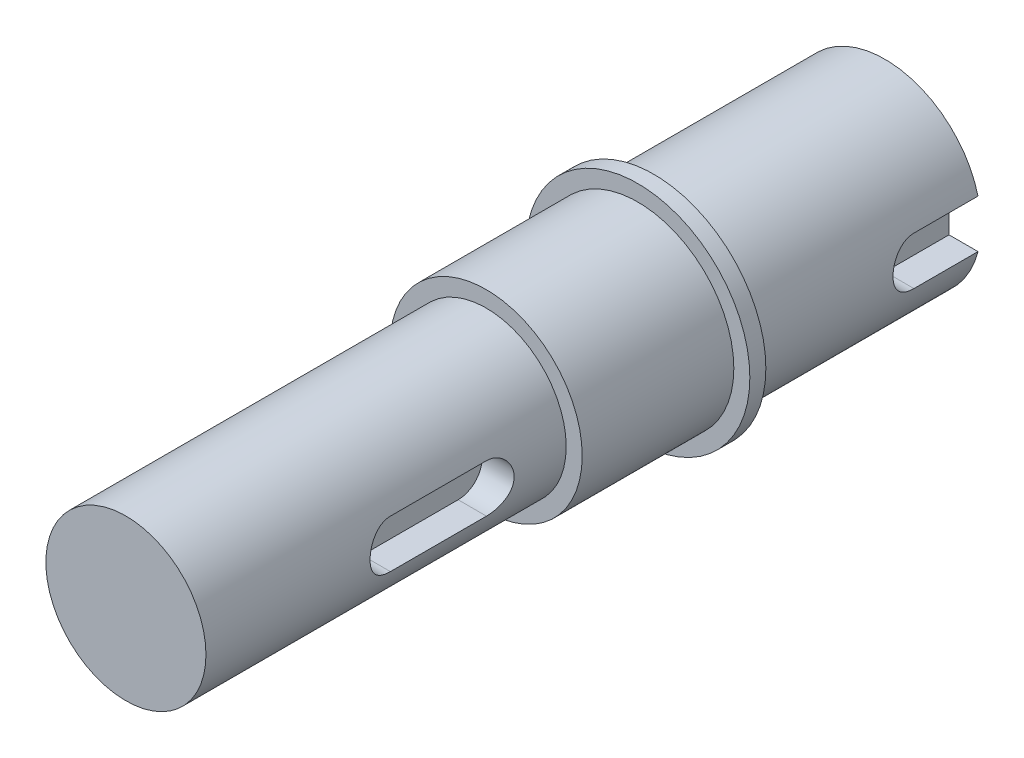
ISO-10303-21;
HEADER;
FILE_DESCRIPTION(('STEP AP214'),'2;1');
FILE_NAME('part.step','',(''),(''),'','','');
FILE_SCHEMA(('AUTOMOTIVE_DESIGN { 1 0 10303 214 1 1 1 1 }'));
ENDSEC;
DATA;
#1=APPLICATION_CONTEXT('core data for automotive mechanical design processes');
#2=APPLICATION_PROTOCOL_DEFINITION('international standard','automotive_design',2000,#1);
#3=PRODUCT_CONTEXT('',#1,'mechanical');
#4=PRODUCT('Part','Part','',(#3));
#5=PRODUCT_RELATED_PRODUCT_CATEGORY('part','',(#4));
#6=PRODUCT_DEFINITION_FORMATION('','',#4);
#7=PRODUCT_DEFINITION_CONTEXT('part definition',#1,'design');
#8=PRODUCT_DEFINITION('design','',#6,#7);
#9=PRODUCT_DEFINITION_SHAPE('','',#8);
#10=(LENGTH_UNIT() NAMED_UNIT(*) SI_UNIT(.MILLI.,.METRE.));
#11=(NAMED_UNIT(*) PLANE_ANGLE_UNIT() SI_UNIT($,.RADIAN.));
#12=(NAMED_UNIT(*) SI_UNIT($,.STERADIAN.) SOLID_ANGLE_UNIT());
#13=UNCERTAINTY_MEASURE_WITH_UNIT(LENGTH_MEASURE(1.E-05),#10,'distance_accuracy_value','');
#14=(GEOMETRIC_REPRESENTATION_CONTEXT(3) GLOBAL_UNCERTAINTY_ASSIGNED_CONTEXT((#13)) GLOBAL_UNIT_ASSIGNED_CONTEXT((#10,
#11,#12)) REPRESENTATION_CONTEXT('',''));
#15=CARTESIAN_POINT('',(0.,0.,0.));
#16=DIRECTION('',(0.,0.,1.));
#17=DIRECTION('',(1.,0.,0.));
#18=AXIS2_PLACEMENT_3D('',#15,#16,#17);
#19=CARTESIAN_POINT('',(0.,0.,-9.47));
#20=DIRECTION('',(0.,0.,-1.));
#21=DIRECTION('',(-1.,0.,0.));
#22=AXIS2_PLACEMENT_3D('',#19,#20,#21);
#23=CYLINDRICAL_SURFACE('',#22,7.);
#24=CARTESIAN_POINT('',(0.,0.,-9.47));
#25=DIRECTION('',(0.,0.,1.));
#26=DIRECTION('',(1.,0.,0.));
#27=AXIS2_PLACEMENT_3D('',#24,#25,#26);
#28=CIRCLE('',#27,7.);
#29=CARTESIAN_POINT('',(7.,0.,-9.47));
#30=VERTEX_POINT('',#29);
#31=EDGE_CURVE('E482',#30,#30,#28,.T.);
#32=ORIENTED_EDGE('',*,*,#31,.F.);
#33=EDGE_LOOP('',(#32));
#34=FACE_BOUND('',#33,.T.);
#35=CARTESIAN_POINT('',(0.,0.,-10.47));
#36=DIRECTION('',(0.,0.,1.));
#37=DIRECTION('',(1.,0.,0.));
#38=AXIS2_PLACEMENT_3D('',#35,#36,#37);
#39=CIRCLE('',#38,7.);
#40=CARTESIAN_POINT('',(7.,0.,-10.47));
#41=VERTEX_POINT('',#40);
#42=EDGE_CURVE('E481',#41,#41,#39,.T.);
#43=ORIENTED_EDGE('',*,*,#42,.T.);
#44=EDGE_LOOP('',(#43));
#45=FACE_BOUND('',#44,.T.);
#46=ADVANCED_FACE('F39',(#34,#45),#23,.T.);
#47=CARTESIAN_POINT('',(0.,0.,-9.47));
#48=DIRECTION('',(0.,0.,1.));
#49=DIRECTION('',(1.,0.,0.));
#50=AXIS2_PLACEMENT_3D('',#47,#48,#49);
#51=PLANE('',#50);
#52=CARTESIAN_POINT('',(0.,0.,-9.47));
#53=DIRECTION('',(0.,0.,1.));
#54=DIRECTION('',(1.,0.,0.));
#55=AXIS2_PLACEMENT_3D('',#52,#53,#54);
#56=CIRCLE('',#55,6.);
#57=CARTESIAN_POINT('',(6.,0.,-9.47));
#58=VERTEX_POINT('',#57);
#59=EDGE_CURVE('E44',#58,#58,#56,.T.);
#60=ORIENTED_EDGE('',*,*,#59,.F.);
#61=EDGE_LOOP('',(#60));
#62=FACE_BOUND('',#61,.T.);
#63=ORIENTED_EDGE('',*,*,#31,.T.);
#64=EDGE_LOOP('',(#63));
#65=FACE_BOUND('',#64,.T.);
#66=ADVANCED_FACE('F223',(#62,#65),#51,.T.);
#67=CARTESIAN_POINT('',(0.,0.,-10.47));
#68=DIRECTION('',(0.,0.,1.));
#69=DIRECTION('',(1.,0.,0.));
#70=AXIS2_PLACEMENT_3D('',#67,#68,#69);
#71=PLANE('',#70);
#72=CARTESIAN_POINT('',(0.,0.,-10.47));
#73=DIRECTION('',(0.,0.,1.));
#74=DIRECTION('',(1.,0.,0.));
#75=AXIS2_PLACEMENT_3D('',#72,#73,#74);
#76=CIRCLE('',#75,6.);
#77=CARTESIAN_POINT('',(6.,0.,-10.47));
#78=VERTEX_POINT('',#77);
#79=EDGE_CURVE('E11',#78,#78,#76,.T.);
#80=ORIENTED_EDGE('',*,*,#79,.T.);
#81=EDGE_LOOP('',(#80));
#82=FACE_BOUND('',#81,.T.);
#83=ORIENTED_EDGE('',*,*,#42,.F.);
#84=EDGE_LOOP('',(#83));
#85=FACE_BOUND('',#84,.T.);
#86=ADVANCED_FACE('F229',(#82,#85),#71,.F.);
#87=CARTESIAN_POINT('',(3.,0.,10.75));
#88=DIRECTION('',(1.,0.,0.));
#89=DIRECTION('',(0.,0.,-1.));
#90=AXIS2_PLACEMENT_3D('',#87,#88,#89);
#91=PLANE('',#90);
#92=CARTESIAN_POINT('',(3.,0.,10.75));
#93=DIRECTION('',(1.,0.,0.));
#94=DIRECTION('',(0.,0.,-1.));
#95=AXIS2_PLACEMENT_3D('',#92,#93,#94);
#96=CIRCLE('',#95,1.5);
#97=CARTESIAN_POINT('',(3.,1.5,10.75));
#98=VERTEX_POINT('',#97);
#99=CARTESIAN_POINT('',(3.,-1.5,10.75));
#100=VERTEX_POINT('',#99);
#101=EDGE_CURVE('E149',#98,#100,#96,.T.);
#102=ORIENTED_EDGE('',*,*,#101,.T.);
#103=DIRECTION('',(0.,0.,-1.));
#104=VECTOR('',#103,1.);
#105=CARTESIAN_POINT('',(3.,-1.5,10.75));
#106=LINE('',#105,#104);
#107=CARTESIAN_POINT('',(3.,-1.5,4.75));
#108=VERTEX_POINT('',#107);
#109=EDGE_CURVE('E152',#100,#108,#106,.T.);
#110=ORIENTED_EDGE('',*,*,#109,.T.);
#111=CARTESIAN_POINT('',(3.,0.,4.75));
#112=DIRECTION('',(1.,0.,0.));
#113=DIRECTION('',(0.,0.,-1.));
#114=AXIS2_PLACEMENT_3D('',#111,#112,#113);
#115=CIRCLE('',#114,1.5);
#116=CARTESIAN_POINT('',(3.,1.5,4.75));
#117=VERTEX_POINT('',#116);
#118=EDGE_CURVE('E155',#108,#117,#115,.T.);
#119=ORIENTED_EDGE('',*,*,#118,.T.);
#120=DIRECTION('',(0.,0.,1.));
#121=VECTOR('',#120,1.);
#122=CARTESIAN_POINT('',(3.,1.5,10.75));
#123=LINE('',#122,#121);
#124=EDGE_CURVE('E158',#117,#98,#123,.T.);
#125=ORIENTED_EDGE('',*,*,#124,.T.);
#126=EDGE_LOOP('',(#102,#110,#119,#125));
#127=FACE_BOUND('',#126,.T.);
#128=ADVANCED_FACE('F266',(#127),#91,.T.);
#129=CARTESIAN_POINT('',(0.,0.,22.5));
#130=DIRECTION('',(0.,0.,1.));
#131=DIRECTION('',(1.,0.,0.));
#132=AXIS2_PLACEMENT_3D('',#129,#130,#131);
#133=PLANE('',#132);
#134=CARTESIAN_POINT('',(0.,0.,22.5));
#135=DIRECTION('',(0.,0.,1.));
#136=DIRECTION('',(1.,0.,0.));
#137=AXIS2_PLACEMENT_3D('',#134,#135,#136);
#138=CIRCLE('',#137,5.);
#139=CARTESIAN_POINT('',(5.,0.,22.5));
#140=VERTEX_POINT('',#139);
#141=EDGE_CURVE('E146',#140,#140,#138,.T.);
#142=ORIENTED_EDGE('',*,*,#141,.T.);
#143=EDGE_LOOP('',(#142));
#144=FACE_BOUND('',#143,.T.);
#145=ADVANCED_FACE('F206',(#144),#133,.T.);
#146=CARTESIAN_POINT('',(3.,0.,10.75));
#147=DIRECTION('',(1.,0.,0.));
#148=DIRECTION('',(0.,0.,-1.));
#149=AXIS2_PLACEMENT_3D('',#146,#147,#148);
#150=CYLINDRICAL_SURFACE('',#149,1.5);
#151=DIRECTION('',(1.,0.,0.));
#152=VECTOR('',#151,1.);
#153=CARTESIAN_POINT('',(3.,-1.5,10.75));
#154=LINE('',#153,#152);
#155=CARTESIAN_POINT('',(4.76969600708473,-1.5,10.75));
#156=VERTEX_POINT('',#155);
#157=EDGE_CURVE('E161',#100,#156,#154,.T.);
#158=ORIENTED_EDGE('',*,*,#157,.F.);
#159=ORIENTED_EDGE('',*,*,#101,.F.);
#160=DIRECTION('',(1.,0.,0.));
#161=VECTOR('',#160,1.);
#162=CARTESIAN_POINT('',(3.,1.5,10.75));
#163=LINE('',#162,#161);
#164=CARTESIAN_POINT('',(4.76969600708473,1.5,10.75));
#165=VERTEX_POINT('',#164);
#166=EDGE_CURVE('E162',#98,#165,#163,.T.);
#167=ORIENTED_EDGE('',*,*,#166,.T.);
#168=CARTESIAN_POINT('',(4.76969600708473,-1.5,10.75));
#169=CARTESIAN_POINT('',(4.76969249084934,-1.50000085357071,10.791179392908));
#170=CARTESIAN_POINT('',(4.77022997000129,-1.49830317083428,10.8323380431261));
#171=CARTESIAN_POINT('',(4.77235095109999,-1.49153785660317,10.9143411620956));
#172=CARTESIAN_POINT('',(4.77393421787376,-1.48647098275841,10.9551856993949));
#173=CARTESIAN_POINT('',(4.78018490618873,-1.46630203689311,11.0765905409547));
#174=CARTESIAN_POINT('',(4.78635370384275,-1.44623120413662,11.1563063904164));
#175=CARTESIAN_POINT('',(4.80195952113208,-1.39353102315626,11.3110355783859));
#176=CARTESIAN_POINT('',(4.81139539670393,-1.36090607068203,11.3860505521981));
#177=CARTESIAN_POINT('',(4.83246571212052,-1.28407841117655,11.5295966815976));
#178=CARTESIAN_POINT('',(4.84410117434933,-1.23987031651226,11.5981247997284));
#179=CARTESIAN_POINT('',(4.86866835244721,-1.13964850658326,11.728866055997));
#180=CARTESIAN_POINT('',(4.88162755412974,-1.08333433465208,11.7908436603434));
#181=CARTESIAN_POINT('',(4.90714811559049,-0.961138919873354,11.9046355839));
#182=CARTESIAN_POINT('',(4.91970940785249,-0.895256063916348,11.9564481860031));
#183=CARTESIAN_POINT('',(4.94333239727705,-0.75410992131543,12.0494637703185));
#184=CARTESIAN_POINT('',(4.95435770971354,-0.678680819336259,12.090425180298));
#185=CARTESIAN_POINT('',(4.97334469846208,-0.521621185505775,12.1589884116182));
#186=CARTESIAN_POINT('',(4.98130716463903,-0.439992259012928,12.1865936777943));
#187=CARTESIAN_POINT('',(4.99307639935002,-0.275324697874879,12.226879799102));
#188=CARTESIAN_POINT('',(4.99699549276993,-0.192393125294254,12.2399648579697));
#189=CARTESIAN_POINT('',(5.00063202022426,-0.0254235719980825,12.2521173413633));
#190=CARTESIAN_POINT('',(5.00035024971471,0.0586141962423617,12.2511874197002));
#191=CARTESIAN_POINT('',(4.99569602566267,0.222571599946016,12.235607091241));
#192=CARTESIAN_POINT('',(4.99145415509187,0.30253714546464,12.2213946550213));
#193=CARTESIAN_POINT('',(4.9795151369998,0.458890052102024,12.1803683647619));
#194=CARTESIAN_POINT('',(4.97181780846028,0.535277225531997,12.1535538505441));
#195=CARTESIAN_POINT('',(4.95365214926145,0.683347815892215,12.0877877783536));
#196=CARTESIAN_POINT('',(4.94315255692525,0.754966006044141,12.0486983556431));
#197=CARTESIAN_POINT('',(4.92049624651755,0.890765529574419,11.9596014099517));
#198=CARTESIAN_POINT('',(4.90833915735884,0.954945191614593,11.9095914405212));
#199=CARTESIAN_POINT('',(4.88311673571409,1.07665450541275,11.7978080119165));
#200=CARTESIAN_POINT('',(4.87003445449554,1.13383351478034,11.7356561362393));
#201=CARTESIAN_POINT('',(4.84484215114658,1.23706769492487,11.6025025765721));
#202=CARTESIAN_POINT('',(4.83273241337565,1.28311962013078,11.5314983196345));
#203=CARTESIAN_POINT('',(4.81077228795653,1.36316407240863,11.3817190715507));
#204=CARTESIAN_POINT('',(4.80094596245948,1.39703006341135,11.3028728204066));
#205=CARTESIAN_POINT('',(4.78495663653201,1.45085886004699,11.1402754960183));
#206=CARTESIAN_POINT('',(4.77878803475875,1.47084293218035,11.0565321392856));
#207=CARTESIAN_POINT('',(4.77314032325006,1.4890120359008,10.9350051109298));
#208=CARTESIAN_POINT('',(4.77185156275267,1.49313202989009,10.8981092658204));
#209=CARTESIAN_POINT('',(4.77012928611782,1.49862355614854,10.8241485209005));
#210=CARTESIAN_POINT('',(4.76969451246644,1.49999912968269,10.7870839503361));
#211=CARTESIAN_POINT('',(4.76969600708473,1.5,10.75));
#212=B_SPLINE_CURVE_WITH_KNOTS('',3,(#168,#169,#170,#171,#172,#173,#174,#175,#176,#177,#178,
#179,#180,#181,#182,#183,#184,#185,#186,#187,#188,#189,#190,#191,#192,#193,#194,#195,#196,#197,
#198,#199,#200,#201,#202,#203,#204,#205,#206,#207,#208,#209,#210,#211),.UNSPECIFIED.,.F.,.F.,(4,
2,2,2,2,2,2,2,2,2,2,2,2,2,2,2,2,2,2,2,2,4),(0.,0.123459071219734,0.246890388853042,
0.49291134961521,0.738846245884325,0.984895736828092,1.23795510798803,1.49105719006936,
1.74939356197455,2.00766326783256,2.25854751319802,2.5093842528947,2.75223130012966,
2.99509107067835,3.2407824256273,3.48652887757004,3.74172568310981,3.99699683536777,
4.25484698071527,4.51230123440207,4.62365084745809,4.73483637253615),.UNSPECIFIED.);
#213=EDGE_CURVE('E64',#156,#165,#212,.T.);
#214=ORIENTED_EDGE('',*,*,#213,.F.);
#215=EDGE_LOOP('',(#158,#159,#167,#214));
#216=FACE_BOUND('',#215,.T.);
#217=ADVANCED_FACE('F201',(#216),#150,.F.);
#218=CARTESIAN_POINT('',(3.,-1.5,10.75));
#219=DIRECTION('',(0.,-1.,0.));
#220=DIRECTION('',(0.,0.,-1.));
#221=AXIS2_PLACEMENT_3D('',#218,#219,#220);
#222=PLANE('',#221);
#223=DIRECTION('',(1.,0.,0.));
#224=VECTOR('',#223,1.);
#225=CARTESIAN_POINT('',(3.,-1.5,4.75));
#226=LINE('',#225,#224);
#227=CARTESIAN_POINT('',(4.76969600708473,-1.5,4.75));
#228=VERTEX_POINT('',#227);
#229=EDGE_CURVE('E168',#108,#228,#226,.T.);
#230=ORIENTED_EDGE('',*,*,#229,.F.);
#231=ORIENTED_EDGE('',*,*,#109,.F.);
#232=ORIENTED_EDGE('',*,*,#157,.T.);
#233=DIRECTION('',(0.,0.,-1.));
#234=VECTOR('',#233,1.);
#235=CARTESIAN_POINT('',(4.76969600708473,-1.5,15.5));
#236=LINE('',#235,#234);
#237=EDGE_CURVE('E279',#228,#156,#236,.F.);
#238=ORIENTED_EDGE('',*,*,#237,.F.);
#239=EDGE_LOOP('',(#230,#231,#232,#238));
#240=FACE_BOUND('',#239,.T.);
#241=ADVANCED_FACE('F197',(#240),#222,.F.);
#242=CARTESIAN_POINT('',(3.,0.,4.75));
#243=DIRECTION('',(1.,0.,0.));
#244=DIRECTION('',(0.,0.,-1.));
#245=AXIS2_PLACEMENT_3D('',#242,#243,#244);
#246=CYLINDRICAL_SURFACE('',#245,1.5);
#247=DIRECTION('',(1.,0.,0.));
#248=VECTOR('',#247,1.);
#249=CARTESIAN_POINT('',(3.,1.5,4.75));
#250=LINE('',#249,#248);
#251=CARTESIAN_POINT('',(4.76969600708473,1.5,4.75));
#252=VERTEX_POINT('',#251);
#253=EDGE_CURVE('E165',#117,#252,#250,.T.);
#254=ORIENTED_EDGE('',*,*,#253,.F.);
#255=ORIENTED_EDGE('',*,*,#118,.F.);
#256=ORIENTED_EDGE('',*,*,#229,.T.);
#257=CARTESIAN_POINT('',(4.76969600708473,1.5,4.75));
#258=CARTESIAN_POINT('',(4.76969249084934,1.50000085357071,4.70882060709199));
#259=CARTESIAN_POINT('',(4.77022997000129,1.49830317083428,4.66766195687388));
#260=CARTESIAN_POINT('',(4.77235095109999,1.49153785660317,4.58565883790444));
#261=CARTESIAN_POINT('',(4.77393421787376,1.48647098275841,4.5448143006051));
#262=CARTESIAN_POINT('',(4.78018490618873,1.46630203689311,4.42340945904534));
#263=CARTESIAN_POINT('',(4.78635370384275,1.44623120413662,4.34369360958362));
#264=CARTESIAN_POINT('',(4.80195952113208,1.39353102315626,4.18896442161413));
#265=CARTESIAN_POINT('',(4.81139539670393,1.36090607068203,4.11394944780192));
#266=CARTESIAN_POINT('',(4.83246571212052,1.28407841117655,3.9704033184024));
#267=CARTESIAN_POINT('',(4.84410117434933,1.23987031651226,3.90187520027156));
#268=CARTESIAN_POINT('',(4.86866835244721,1.13964850658326,3.77113394400295));
#269=CARTESIAN_POINT('',(4.88162755412974,1.08333433465208,3.7091563396566));
#270=CARTESIAN_POINT('',(4.90714811559049,0.961138919873352,3.59536441610003));
#271=CARTESIAN_POINT('',(4.91970940785249,0.895256063916345,3.54355181399695));
#272=CARTESIAN_POINT('',(4.94333239727705,0.754109921315427,3.45053622968151));
#273=CARTESIAN_POINT('',(4.95435770971354,0.678680819336256,3.40957481970205));
#274=CARTESIAN_POINT('',(4.97334469846208,0.521621185505772,3.34101158838185));
#275=CARTESIAN_POINT('',(4.98130716463903,0.439992259012925,3.31340632220572));
#276=CARTESIAN_POINT('',(4.99307639935002,0.275324697874876,3.27312020089795));
#277=CARTESIAN_POINT('',(4.99699549276993,0.192393125294252,3.26003514203026));
#278=CARTESIAN_POINT('',(5.00063202022426,0.0254235719980797,3.24788265863674));
#279=CARTESIAN_POINT('',(5.00035024971471,-0.0586141962423646,3.24881258029984));
#280=CARTESIAN_POINT('',(4.99569602566267,-0.222571599946019,3.264392908759));
#281=CARTESIAN_POINT('',(4.99145415509187,-0.302537145464643,3.27860534497872));
#282=CARTESIAN_POINT('',(4.9795151369998,-0.458890052102027,3.31963163523811));
#283=CARTESIAN_POINT('',(4.97181780846028,-0.535277225531999,3.34644614945594));
#284=CARTESIAN_POINT('',(4.95365214926145,-0.683347815892218,3.41221222164644));
#285=CARTESIAN_POINT('',(4.94315255692525,-0.754966006044144,3.45130164435694));
#286=CARTESIAN_POINT('',(4.92049624651755,-0.890765529574422,3.54039859004832));
#287=CARTESIAN_POINT('',(4.90833915735884,-0.954945191614596,3.59040855947883));
#288=CARTESIAN_POINT('',(4.88311673571409,-1.07665450541275,3.70219198808351));
#289=CARTESIAN_POINT('',(4.87003445449554,-1.13383351478034,3.76434386376075));
#290=CARTESIAN_POINT('',(4.84484215114658,-1.23706769492487,3.89749742342792));
#291=CARTESIAN_POINT('',(4.83273241337565,-1.28311962013078,3.96850168036553));
#292=CARTESIAN_POINT('',(4.81077228795653,-1.36316407240863,4.11828092844929));
#293=CARTESIAN_POINT('',(4.80094596245948,-1.39703006341135,4.19712717959341));
#294=CARTESIAN_POINT('',(4.78495663653201,-1.45085886004699,4.35972450398174));
#295=CARTESIAN_POINT('',(4.77878803475875,-1.47084293218035,4.44346786071438));
#296=CARTESIAN_POINT('',(4.77314032325006,-1.4890120359008,4.56499488907019));
#297=CARTESIAN_POINT('',(4.77185156275267,-1.49313202989009,4.60189073417961));
#298=CARTESIAN_POINT('',(4.77012928611782,-1.49862355614854,4.67585147909953));
#299=CARTESIAN_POINT('',(4.76969451246644,-1.49999912968269,4.71291604966386));
#300=CARTESIAN_POINT('',(4.76969600708473,-1.5,4.75));
#301=B_SPLINE_CURVE_WITH_KNOTS('',3,(#257,#258,#259,#260,#261,#262,#263,#264,#265,#266,#267,
#268,#269,#270,#271,#272,#273,#274,#275,#276,#277,#278,#279,#280,#281,#282,#283,#284,#285,#286,
#287,#288,#289,#290,#291,#292,#293,#294,#295,#296,#297,#298,#299,#300),.UNSPECIFIED.,.F.,.F.,(4,
2,2,2,2,2,2,2,2,2,2,2,2,2,2,2,2,2,2,2,2,4),(0.,0.123459071219734,0.246890388853043,
0.492911349615211,0.738846245884325,0.984895736828093,1.23795510798803,1.49105719006936,
1.74939356197455,2.00766326783256,2.25854751319802,2.5093842528947,2.75223130012966,
2.99509107067835,3.2407824256273,3.48652887757005,3.74172568310981,3.99699683536777,
4.25484698071527,4.51230123440207,4.62365084745809,4.73483637253615),.UNSPECIFIED.);
#302=EDGE_CURVE('E177',#252,#228,#301,.T.);
#303=ORIENTED_EDGE('',*,*,#302,.F.);
#304=EDGE_LOOP('',(#254,#255,#256,#303));
#305=FACE_BOUND('',#304,.T.);
#306=ADVANCED_FACE('F191',(#305),#246,.F.);
#307=CARTESIAN_POINT('',(3.,1.5,10.75));
#308=DIRECTION('',(0.,1.,0.));
#309=DIRECTION('',(0.,0.,1.));
#310=AXIS2_PLACEMENT_3D('',#307,#308,#309);
#311=PLANE('',#310);
#312=ORIENTED_EDGE('',*,*,#166,.F.);
#313=ORIENTED_EDGE('',*,*,#124,.F.);
#314=ORIENTED_EDGE('',*,*,#253,.T.);
#315=DIRECTION('',(0.,0.,-1.));
#316=VECTOR('',#315,1.);
#317=CARTESIAN_POINT('',(4.76969600708473,1.5,15.5));
#318=LINE('',#317,#316);
#319=EDGE_CURVE('E282',#165,#252,#318,.T.);
#320=ORIENTED_EDGE('',*,*,#319,.F.);
#321=EDGE_LOOP('',(#312,#313,#314,#320));
#322=FACE_BOUND('',#321,.T.);
#323=ADVANCED_FACE('F196',(#322),#311,.F.);
#324=CARTESIAN_POINT('',(0.,0.,15.5));
#325=DIRECTION('',(0.,0.,-1.));
#326=DIRECTION('',(-1.,0.,0.));
#327=AXIS2_PLACEMENT_3D('',#324,#325,#326);
#328=CYLINDRICAL_SURFACE('',#327,5.);
#329=ORIENTED_EDGE('',*,*,#319,.T.);
#330=ORIENTED_EDGE('',*,*,#302,.T.);
#331=ORIENTED_EDGE('',*,*,#237,.T.);
#332=ORIENTED_EDGE('',*,*,#213,.T.);
#333=EDGE_LOOP('',(#329,#330,#331,#332));
#334=FACE_BOUND('',#333,.T.);
#335=CARTESIAN_POINT('',(0.,0.,0.));
#336=DIRECTION('',(0.,0.,1.));
#337=DIRECTION('',(1.,0.,0.));
#338=AXIS2_PLACEMENT_3D('',#335,#336,#337);
#339=CIRCLE('',#338,5.);
#340=CARTESIAN_POINT('',(5.,0.,0.));
#341=VERTEX_POINT('',#340);
#342=EDGE_CURVE('E174',#341,#341,#339,.T.);
#343=ORIENTED_EDGE('',*,*,#342,.T.);
#344=EDGE_LOOP('',(#343));
#345=FACE_BOUND('',#344,.T.);
#346=ORIENTED_EDGE('',*,*,#141,.F.);
#347=EDGE_LOOP('',(#346));
#348=FACE_BOUND('',#347,.T.);
#349=ADVANCED_FACE('F41',(#334,#345,#348),#328,.T.);
#350=CARTESIAN_POINT('',(0.,0.,0.));
#351=DIRECTION('',(0.,0.,-1.));
#352=DIRECTION('',(-1.,0.,0.));
#353=AXIS2_PLACEMENT_3D('',#350,#351,#352);
#354=PLANE('',#353);
#355=ORIENTED_EDGE('',*,*,#342,.F.);
#356=EDGE_LOOP('',(#355));
#357=FACE_BOUND('',#356,.T.);
#358=CARTESIAN_POINT('',(0.,0.,0.));
#359=DIRECTION('',(0.,0.,-1.));
#360=DIRECTION('',(-1.,0.,0.));
#361=AXIS2_PLACEMENT_3D('',#358,#359,#360);
#362=CIRCLE('',#361,6.);
#363=CARTESIAN_POINT('',(-6.,0.,0.));
#364=VERTEX_POINT('',#363);
#365=EDGE_CURVE('E164',#364,#364,#362,.T.);
#366=ORIENTED_EDGE('',*,*,#365,.F.);
#367=EDGE_LOOP('',(#366));
#368=FACE_BOUND('',#367,.T.);
#369=ADVANCED_FACE('F207',(#357,#368),#354,.F.);
#370=CARTESIAN_POINT('',(0.,0.,-17.91));
#371=DIRECTION('',(0.,0.,1.));
#372=DIRECTION('',(1.,0.,0.));
#373=AXIS2_PLACEMENT_3D('',#370,#371,#372);
#374=CYLINDRICAL_SURFACE('',#373,6.);
#375=ORIENTED_EDGE('',*,*,#59,.T.);
#376=EDGE_LOOP('',(#375));
#377=FACE_BOUND('',#376,.T.);
#378=ORIENTED_EDGE('',*,*,#365,.T.);
#379=EDGE_LOOP('',(#378));
#380=FACE_BOUND('',#379,.T.);
#381=ADVANCED_FACE('F209',(#377,#380),#374,.T.);
#382=CARTESIAN_POINT('',(0.,0.,-14.91));
#383=DIRECTION('',(0.,0.,-1.));
#384=DIRECTION('',(-1.,0.,0.));
#385=AXIS2_PLACEMENT_3D('',#382,#383,#384);
#386=PLANE('',#385);
#387=CARTESIAN_POINT('',(0.,0.,-14.91));
#388=DIRECTION('',(0.,0.,-1.));
#389=DIRECTION('',(-1.,0.,0.));
#390=AXIS2_PLACEMENT_3D('',#387,#388,#389);
#391=CIRCLE('',#390,1.25);
#392=CARTESIAN_POINT('',(-1.25,0.,-14.91));
#393=VERTEX_POINT('',#392);
#394=EDGE_CURVE('E125',#393,#393,#391,.T.);
#395=ORIENTED_EDGE('',*,*,#394,.T.);
#396=EDGE_LOOP('',(#395));
#397=FACE_BOUND('',#396,.T.);
#398=ADVANCED_FACE('F212',(#397),#386,.T.);
#399=CARTESIAN_POINT('',(0.,0.,-14.91));
#400=DIRECTION('',(0.,0.,-1.));
#401=DIRECTION('',(-1.,0.,0.));
#402=AXIS2_PLACEMENT_3D('',#399,#400,#401);
#403=CYLINDRICAL_SURFACE('',#402,1.25);
#404=ORIENTED_EDGE('',*,*,#394,.F.);
#405=EDGE_LOOP('',(#404));
#406=FACE_BOUND('',#405,.T.);
#407=CARTESIAN_POINT('',(0.,0.,-24.91));
#408=DIRECTION('',(0.,0.,-1.));
#409=DIRECTION('',(-1.,0.,0.));
#410=AXIS2_PLACEMENT_3D('',#407,#408,#409);
#411=CIRCLE('',#410,1.25);
#412=CARTESIAN_POINT('',(-1.25,0.,-24.91));
#413=VERTEX_POINT('',#412);
#414=EDGE_CURVE('E128',#413,#413,#411,.T.);
#415=ORIENTED_EDGE('',*,*,#414,.T.);
#416=EDGE_LOOP('',(#415));
#417=FACE_BOUND('',#416,.T.);
#418=ADVANCED_FACE('F217',(#406,#417),#403,.F.);
#419=CARTESIAN_POINT('',(4.,0.,-20.91));
#420=DIRECTION('',(1.,0.,0.));
#421=DIRECTION('',(0.,0.,-1.));
#422=AXIS2_PLACEMENT_3D('',#419,#420,#421);
#423=PLANE('',#422);
#424=DIRECTION('',(0.,0.,1.));
#425=VECTOR('',#424,1.);
#426=CARTESIAN_POINT('',(4.,1.5,-20.91));
#427=LINE('',#426,#425);
#428=CARTESIAN_POINT('',(4.,1.5,-24.91));
#429=VERTEX_POINT('',#428);
#430=CARTESIAN_POINT('',(4.,1.5,-20.91));
#431=VERTEX_POINT('',#430);
#432=EDGE_CURVE('E117',#429,#431,#427,.T.);
#433=ORIENTED_EDGE('',*,*,#432,.T.);
#434=CARTESIAN_POINT('',(4.,0.,-20.91));
#435=DIRECTION('',(1.,0.,0.));
#436=DIRECTION('',(0.,0.,-1.));
#437=AXIS2_PLACEMENT_3D('',#434,#435,#436);
#438=CIRCLE('',#437,1.5);
#439=CARTESIAN_POINT('',(4.,-1.5,-20.91));
#440=VERTEX_POINT('',#439);
#441=EDGE_CURVE('E111',#431,#440,#438,.T.);
#442=ORIENTED_EDGE('',*,*,#441,.T.);
#443=DIRECTION('',(0.,0.,-1.));
#444=VECTOR('',#443,1.);
#445=CARTESIAN_POINT('',(4.,-1.5,-20.91));
#446=LINE('',#445,#444);
#447=CARTESIAN_POINT('',(4.,-1.5,-24.91));
#448=VERTEX_POINT('',#447);
#449=EDGE_CURVE('E56',#440,#448,#446,.T.);
#450=ORIENTED_EDGE('',*,*,#449,.T.);
#451=DIRECTION('',(0.,-1.,0.));
#452=VECTOR('',#451,1.);
#453=CARTESIAN_POINT('',(4.,0.,-24.91));
#454=LINE('',#453,#452);
#455=EDGE_CURVE('E259',#429,#448,#454,.T.);
#456=ORIENTED_EDGE('',*,*,#455,.F.);
#457=EDGE_LOOP('',(#433,#442,#450,#456));
#458=FACE_BOUND('',#457,.T.);
#459=ADVANCED_FACE('F123',(#458),#423,.T.);
#460=CARTESIAN_POINT('',(0.,0.,-24.91));
#461=DIRECTION('',(0.,0.,-1.));
#462=DIRECTION('',(-1.,0.,0.));
#463=AXIS2_PLACEMENT_3D('',#460,#461,#462);
#464=PLANE('',#463);
#465=ORIENTED_EDGE('',*,*,#414,.F.);
#466=EDGE_LOOP('',(#465));
#467=FACE_BOUND('',#466,.T.);
#468=DIRECTION('',(1.,0.,0.));
#469=VECTOR('',#468,1.);
#470=CARTESIAN_POINT('',(4.,1.5,-24.91));
#471=LINE('',#470,#469);
#472=CARTESIAN_POINT('',(5.80947501931113,1.5,-24.91));
#473=VERTEX_POINT('',#472);
#474=EDGE_CURVE('E136',#429,#473,#471,.T.);
#475=ORIENTED_EDGE('',*,*,#474,.F.);
#476=ORIENTED_EDGE('',*,*,#455,.T.);
#477=DIRECTION('',(1.,0.,0.));
#478=VECTOR('',#477,1.);
#479=CARTESIAN_POINT('',(4.,-1.5,-24.91));
#480=LINE('',#479,#478);
#481=CARTESIAN_POINT('',(5.80947501931113,-1.5,-24.91));
#482=VERTEX_POINT('',#481);
#483=EDGE_CURVE('E116',#448,#482,#480,.T.);
#484=ORIENTED_EDGE('',*,*,#483,.T.);
#485=CARTESIAN_POINT('',(0.,0.,-24.91));
#486=DIRECTION('',(0.,0.,-1.));
#487=DIRECTION('',(-1.,0.,0.));
#488=AXIS2_PLACEMENT_3D('',#485,#486,#487);
#489=CIRCLE('',#488,6.);
#490=EDGE_CURVE('E143',#482,#473,#489,.T.);
#491=ORIENTED_EDGE('',*,*,#490,.T.);
#492=EDGE_LOOP('',(#475,#476,#484,#491));
#493=FACE_BOUND('',#492,.T.);
#494=ADVANCED_FACE('F241',(#467,#493),#464,.T.);
#495=CARTESIAN_POINT('',(4.,1.5,-20.91));
#496=DIRECTION('',(0.,1.,0.));
#497=DIRECTION('',(0.,0.,1.));
#498=AXIS2_PLACEMENT_3D('',#495,#496,#497);
#499=PLANE('',#498);
#500=DIRECTION('',(1.,0.,0.));
#501=VECTOR('',#500,1.);
#502=CARTESIAN_POINT('',(4.,1.5,-20.91));
#503=LINE('',#502,#501);
#504=CARTESIAN_POINT('',(5.80947501931113,1.5,-20.91));
#505=VERTEX_POINT('',#504);
#506=EDGE_CURVE('E133',#431,#505,#503,.T.);
#507=ORIENTED_EDGE('',*,*,#506,.F.);
#508=ORIENTED_EDGE('',*,*,#432,.F.);
#509=ORIENTED_EDGE('',*,*,#474,.T.);
#510=DIRECTION('',(0.,0.,1.));
#511=VECTOR('',#510,1.);
#512=CARTESIAN_POINT('',(5.80947501931113,1.5,-24.91));
#513=LINE('',#512,#511);
#514=EDGE_CURVE('E140',#505,#473,#513,.F.);
#515=ORIENTED_EDGE('',*,*,#514,.F.);
#516=EDGE_LOOP('',(#507,#508,#509,#515));
#517=FACE_BOUND('',#516,.T.);
#518=ADVANCED_FACE('F242',(#517),#499,.F.);
#519=CARTESIAN_POINT('',(4.,0.,-20.91));
#520=DIRECTION('',(1.,0.,0.));
#521=DIRECTION('',(0.,0.,-1.));
#522=AXIS2_PLACEMENT_3D('',#519,#520,#521);
#523=CYLINDRICAL_SURFACE('',#522,1.5);
#524=DIRECTION('',(1.,0.,0.));
#525=VECTOR('',#524,1.);
#526=CARTESIAN_POINT('',(4.,-1.5,-20.91));
#527=LINE('',#526,#525);
#528=CARTESIAN_POINT('',(5.80947501931113,-1.5,-20.91));
#529=VERTEX_POINT('',#528);
#530=EDGE_CURVE('E108',#440,#529,#527,.T.);
#531=ORIENTED_EDGE('',*,*,#530,.F.);
#532=ORIENTED_EDGE('',*,*,#441,.F.);
#533=ORIENTED_EDGE('',*,*,#506,.T.);
#534=CARTESIAN_POINT('',(5.80947501931113,-1.5,-20.91));
#535=CARTESIAN_POINT('',(5.80947222870266,-1.50000050624417,-20.8685055223402));
#536=CARTESIAN_POINT('',(5.80992014924206,-1.49827711106305,-20.8270316054727));
#537=CARTESIAN_POINT('',(5.81168857161838,-1.49140694309363,-20.7443939470447));
#538=CARTESIAN_POINT('',(5.81300892662531,-1.48626074635902,-20.7032301544694));
#539=CARTESIAN_POINT('',(5.81822566458081,-1.46576285907379,-20.5808202401867));
#540=CARTESIAN_POINT('',(5.82337804723213,-1.44535154275874,-20.5004152972767));
#541=CARTESIAN_POINT('',(5.83643133882004,-1.391697114372,-20.3443129893271));
#542=CARTESIAN_POINT('',(5.84433198946395,-1.35845520813576,-20.2686151826807));
#543=CARTESIAN_POINT('',(5.86198701707909,-1.2801230670388,-20.123832827029));
#544=CARTESIAN_POINT('',(5.8717418909347,-1.2350296550354,-20.0547500581636));
#545=CARTESIAN_POINT('',(5.89224393597038,-1.1332267077421,-19.9236841771409));
#546=CARTESIAN_POINT('',(5.90300686543374,-1.07630590317597,-19.8618676706317));
#547=CARTESIAN_POINT('',(5.9241765659429,-0.952913670774347,-19.7485468657759));
#548=CARTESIAN_POINT('',(5.93458327983806,-0.886440719218249,-19.6970442157981));
#549=CARTESIAN_POINT('',(5.95404273424872,-0.744685349102538,-19.605133497572));
#550=CARTESIAN_POINT('',(5.96307457022595,-0.669293010501712,-19.564890156024));
#551=CARTESIAN_POINT('',(5.97858519375883,-0.51255388626438,-19.4977128987049));
#552=CARTESIAN_POINT('',(5.98506448372051,-0.431208276124515,-19.4707763635503));
#553=CARTESIAN_POINT('',(5.99462850007692,-0.26661616278774,-19.4315115108339));
#554=CARTESIAN_POINT('',(5.99777929351951,-0.183441483004287,-19.4188984913658));
#555=CARTESIAN_POINT('',(6.00056157226223,-0.0160991635225201,-19.4077449426851));
#556=CARTESIAN_POINT('',(6.00019349990167,0.0680683500430574,-19.4092026447115));
#557=CARTESIAN_POINT('',(5.99602856048604,0.233028739458143,-19.4259449455282));
#558=CARTESIAN_POINT('',(5.99230798016041,0.313855052609781,-19.4409219248992));
#559=CARTESIAN_POINT('',(5.98194495954744,0.471808066626508,-19.4837830187741));
#560=CARTESIAN_POINT('',(5.97530238998334,0.54893460363598,-19.5116677043529));
#561=CARTESIAN_POINT('',(5.95972496642698,0.698110929036807,-19.579801921006));
#562=CARTESIAN_POINT('',(5.95076990741333,0.770108444403372,-19.6201610913493));
#563=CARTESIAN_POINT('',(5.93153918312879,0.906414946845021,-19.7120146947502));
#564=CARTESIAN_POINT('',(5.92126331899798,0.970722773343433,-19.7635108053798));
#565=CARTESIAN_POINT('',(5.90018349034298,1.09165408456273,-19.877818368122));
#566=CARTESIAN_POINT('',(5.88937275716528,1.14802365458119,-19.9408974548097));
#567=CARTESIAN_POINT('',(5.8686925242601,1.24945436277936,-20.0757448003916));
#568=CARTESIAN_POINT('',(5.8588232826449,1.29451240536759,-20.1475154299253));
#569=CARTESIAN_POINT('',(5.84111720379488,1.37220706392894,-20.2982183967356));
#570=CARTESIAN_POINT('',(5.83329159013705,1.4047755268309,-20.3771871973441));
#571=CARTESIAN_POINT('',(5.82070588210583,1.45605352777474,-20.5396753926274));
#572=CARTESIAN_POINT('',(5.81594120642153,1.4747837838182,-20.6231877827248));
#573=CARTESIAN_POINT('',(5.81182936022286,1.49085695272641,-20.7411860711384));
#574=CARTESIAN_POINT('',(5.8109478466629,1.49428618645006,-20.7748795548198));
#575=CARTESIAN_POINT('',(5.80977093733462,1.49885513654609,-20.842376684864));
#576=CARTESIAN_POINT('',(5.80947459329191,1.49999855714407,-20.8761800639329));
#577=CARTESIAN_POINT('',(5.80947501931113,1.5,-20.91));
#578=B_SPLINE_CURVE_WITH_KNOTS('',3,(#534,#535,#536,#537,#538,#539,#540,#541,#542,#543,#544,
#545,#546,#547,#548,#549,#550,#551,#552,#553,#554,#555,#556,#557,#558,#559,#560,#561,#562,#563,
#564,#565,#566,#567,#568,#569,#570,#571,#572,#573,#574,#575,#576,#577),.UNSPECIFIED.,.F.,.F.,(4,
2,2,2,2,2,2,2,2,2,2,2,2,2,2,2,2,2,2,2,2,4),(0.,0.124404795509654,0.248788659126978,
0.496844944620475,0.744877923137243,0.992977462090119,1.24596284614196,1.49898863030879,
1.75554280647352,2.01204646098637,2.26335722272987,2.51463639384958,2.76033818218913,
3.00605084213757,3.25398764175565,3.50196181446493,3.75662144301813,4.01135068771451,
4.26745080241601,4.52316671309978,4.62473773083972,4.72614401597507),.UNSPECIFIED.);
#579=EDGE_CURVE('E49',#529,#505,#578,.T.);
#580=ORIENTED_EDGE('',*,*,#579,.F.);
#581=EDGE_LOOP('',(#531,#532,#533,#580));
#582=FACE_BOUND('',#581,.T.);
#583=ADVANCED_FACE('F109',(#582),#523,.F.);
#584=CARTESIAN_POINT('',(4.,-1.5,-20.91));
#585=DIRECTION('',(0.,-1.,0.));
#586=DIRECTION('',(0.,0.,-1.));
#587=AXIS2_PLACEMENT_3D('',#584,#585,#586);
#588=PLANE('',#587);
#589=ORIENTED_EDGE('',*,*,#483,.F.);
#590=ORIENTED_EDGE('',*,*,#449,.F.);
#591=ORIENTED_EDGE('',*,*,#530,.T.);
#592=DIRECTION('',(0.,0.,1.));
#593=VECTOR('',#592,1.);
#594=CARTESIAN_POINT('',(5.80947501931113,-1.5,-24.91));
#595=LINE('',#594,#593);
#596=EDGE_CURVE('E135',#482,#529,#595,.T.);
#597=ORIENTED_EDGE('',*,*,#596,.F.);
#598=EDGE_LOOP('',(#589,#590,#591,#597));
#599=FACE_BOUND('',#598,.T.);
#600=ADVANCED_FACE('F119',(#599),#588,.F.);
#601=CARTESIAN_POINT('',(0.,0.,-24.91));
#602=DIRECTION('',(0.,0.,1.));
#603=DIRECTION('',(1.,0.,0.));
#604=AXIS2_PLACEMENT_3D('',#601,#602,#603);
#605=CYLINDRICAL_SURFACE('',#604,6.);
#606=ORIENTED_EDGE('',*,*,#596,.T.);
#607=ORIENTED_EDGE('',*,*,#579,.T.);
#608=ORIENTED_EDGE('',*,*,#514,.T.);
#609=ORIENTED_EDGE('',*,*,#490,.F.);
#610=EDGE_LOOP('',(#606,#607,#608,#609));
#611=FACE_BOUND('',#610,.T.);
#612=ORIENTED_EDGE('',*,*,#79,.F.);
#613=EDGE_LOOP('',(#612));
#614=FACE_BOUND('',#613,.T.);
#615=ADVANCED_FACE('F248',(#611,#614),#605,.T.);
#616=CLOSED_SHELL('',(#46,#66,#86,#128,#145,#217,#241,#306,#323,#349,#369,#381,#398,#418,#459,
#494,#518,#583,#600,#615));
#617=MANIFOLD_SOLID_BREP('B2',#616);
#618=ADVANCED_BREP_SHAPE_REPRESENTATION('',(#18,#617),#14);
#619=SHAPE_DEFINITION_REPRESENTATION(#9,#618);
ENDSEC;
END-ISO-10303-21;
